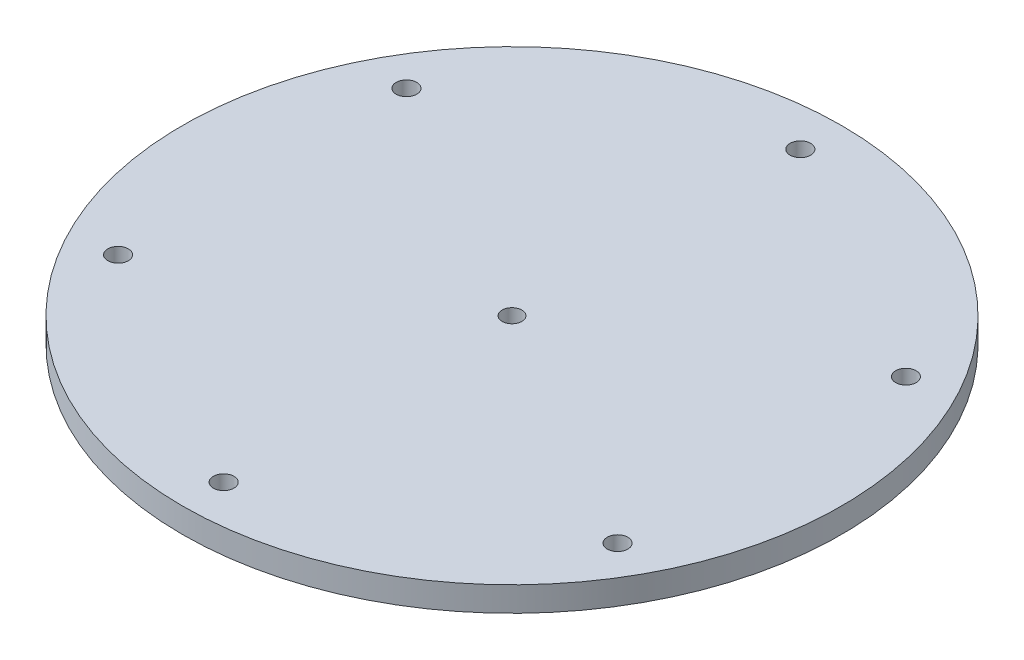
ISO-10303-21;
HEADER;
FILE_DESCRIPTION(('STEP AP214'),'2;1');
FILE_NAME('part.step','',(''),(''),'','','');
FILE_SCHEMA(('AUTOMOTIVE_DESIGN { 1 0 10303 214 1 1 1 1 }'));
ENDSEC;
DATA;
#1=APPLICATION_CONTEXT('core data for automotive mechanical design processes');
#2=APPLICATION_PROTOCOL_DEFINITION('international standard','automotive_design',2000,#1);
#3=PRODUCT_CONTEXT('',#1,'mechanical');
#4=PRODUCT('Part','Part','',(#3));
#5=PRODUCT_RELATED_PRODUCT_CATEGORY('part','',(#4));
#6=PRODUCT_DEFINITION_FORMATION('','',#4);
#7=PRODUCT_DEFINITION_CONTEXT('part definition',#1,'design');
#8=PRODUCT_DEFINITION('design','',#6,#7);
#9=PRODUCT_DEFINITION_SHAPE('','',#8);
#10=(LENGTH_UNIT() NAMED_UNIT(*) SI_UNIT(.MILLI.,.METRE.));
#11=(NAMED_UNIT(*) PLANE_ANGLE_UNIT() SI_UNIT($,.RADIAN.));
#12=(NAMED_UNIT(*) SI_UNIT($,.STERADIAN.) SOLID_ANGLE_UNIT());
#13=UNCERTAINTY_MEASURE_WITH_UNIT(LENGTH_MEASURE(1.E-05),#10,'distance_accuracy_value','');
#14=(GEOMETRIC_REPRESENTATION_CONTEXT(3) GLOBAL_UNCERTAINTY_ASSIGNED_CONTEXT((#13)) GLOBAL_UNIT_ASSIGNED_CONTEXT((#10,
#11,#12)) REPRESENTATION_CONTEXT('',''));
#15=CARTESIAN_POINT('',(0.,0.,0.));
#16=DIRECTION('',(0.,0.,1.));
#17=DIRECTION('',(1.,0.,0.));
#18=AXIS2_PLACEMENT_3D('',#15,#16,#17);
#19=CARTESIAN_POINT('',(0.,6.,0.));
#20=DIRECTION('',(0.,1.,0.));
#21=DIRECTION('',(0.,0.,1.));
#22=AXIS2_PLACEMENT_3D('',#19,#20,#21);
#23=PLANE('',#22);
#24=CARTESIAN_POINT('',(-60.6217782649063,6.,35.0000000000026));
#25=DIRECTION('',(0.,1.,0.));
#26=DIRECTION('',(0.,0.,1.));
#27=AXIS2_PLACEMENT_3D('',#24,#25,#26);
#28=CIRCLE('',#27,2.50000000000565);
#29=CARTESIAN_POINT('',(-60.6217782649063,6.,37.5000000000083));
#30=VERTEX_POINT('',#29);
#31=EDGE_CURVE('E71',#30,#30,#28,.T.);
#32=ORIENTED_EDGE('',*,*,#31,.F.);
#33=EDGE_LOOP('',(#32));
#34=FACE_BOUND('',#33,.T.);
#35=CARTESIAN_POINT('',(60.6217782649152,6.,34.9999999999974));
#36=DIRECTION('',(0.,1.,0.));
#37=DIRECTION('',(0.,0.,1.));
#38=AXIS2_PLACEMENT_3D('',#35,#36,#37);
#39=CIRCLE('',#38,2.50000000000384);
#40=CARTESIAN_POINT('',(60.6217782649152,6.,37.5000000000013));
#41=VERTEX_POINT('',#40);
#42=EDGE_CURVE('E59',#41,#41,#39,.T.);
#43=ORIENTED_EDGE('',*,*,#42,.F.);
#44=EDGE_LOOP('',(#43));
#45=FACE_BOUND('',#44,.T.);
#46=CARTESIAN_POINT('',(0.,6.,0.));
#47=DIRECTION('',(0.,1.,0.));
#48=DIRECTION('',(0.,0.,1.));
#49=AXIS2_PLACEMENT_3D('',#46,#47,#48);
#50=CIRCLE('',#49,2.4);
#51=CARTESIAN_POINT('',(0.,6.,2.4));
#52=VERTEX_POINT('',#51);
#53=EDGE_CURVE('E47',#52,#52,#50,.T.);
#54=ORIENTED_EDGE('',*,*,#53,.F.);
#55=EDGE_LOOP('',(#54));
#56=FACE_BOUND('',#55,.T.);
#57=CARTESIAN_POINT('',(0.,6.,0.));
#58=DIRECTION('',(0.,1.,0.));
#59=DIRECTION('',(0.,0.,1.));
#60=AXIS2_PLACEMENT_3D('',#57,#58,#59);
#61=CIRCLE('',#60,80.);
#62=CARTESIAN_POINT('',(0.,6.,80.));
#63=VERTEX_POINT('',#62);
#64=EDGE_CURVE('E10',#63,#63,#61,.T.);
#65=ORIENTED_EDGE('',*,*,#64,.T.);
#66=EDGE_LOOP('',(#65));
#67=FACE_BOUND('',#66,.T.);
#68=CARTESIAN_POINT('',(0.,6.,-70.));
#69=DIRECTION('',(0.,1.,0.));
#70=DIRECTION('',(0.,0.,1.));
#71=AXIS2_PLACEMENT_3D('',#68,#69,#70);
#72=CIRCLE('',#71,2.5);
#73=CARTESIAN_POINT('',(0.,6.,-67.5));
#74=VERTEX_POINT('',#73);
#75=EDGE_CURVE('E42',#74,#74,#72,.T.);
#76=ORIENTED_EDGE('',*,*,#75,.F.);
#77=EDGE_LOOP('',(#76));
#78=FACE_BOUND('',#77,.T.);
#79=CARTESIAN_POINT('',(60.6217782649122,6.,-35.0000000000026));
#80=DIRECTION('',(0.,1.,0.));
#81=DIRECTION('',(0.,0.,1.));
#82=AXIS2_PLACEMENT_3D('',#79,#80,#81);
#83=CIRCLE('',#82,2.50000000000082);
#84=CARTESIAN_POINT('',(60.6217782649122,6.,-32.5000000000018));
#85=VERTEX_POINT('',#84);
#86=EDGE_CURVE('E53',#85,#85,#83,.T.);
#87=ORIENTED_EDGE('',*,*,#86,.F.);
#88=EDGE_LOOP('',(#87));
#89=FACE_BOUND('',#88,.T.);
#90=CARTESIAN_POINT('',(5.94284139760275E-12,6.,70.));
#91=DIRECTION('',(0.,1.,0.));
#92=DIRECTION('',(0.,0.,1.));
#93=AXIS2_PLACEMENT_3D('',#90,#91,#92);
#94=CIRCLE('',#93,2.50000000000615);
#95=CARTESIAN_POINT('',(5.94284139760275E-12,6.,72.5000000000062));
#96=VERTEX_POINT('',#95);
#97=EDGE_CURVE('E65',#96,#96,#94,.T.);
#98=ORIENTED_EDGE('',*,*,#97,.F.);
#99=EDGE_LOOP('',(#98));
#100=FACE_BOUND('',#99,.T.);
#101=CARTESIAN_POINT('',(-60.6217782649093,6.,-34.9999999999974));
#102=DIRECTION('',(0.,1.,0.));
#103=DIRECTION('',(0.,0.,1.));
#104=AXIS2_PLACEMENT_3D('',#101,#102,#103);
#105=CIRCLE('',#104,2.500000000003);
#106=CARTESIAN_POINT('',(-60.6217782649093,6.,-32.4999999999944));
#107=VERTEX_POINT('',#106);
#108=EDGE_CURVE('E77',#107,#107,#105,.T.);
#109=ORIENTED_EDGE('',*,*,#108,.F.);
#110=EDGE_LOOP('',(#109));
#111=FACE_BOUND('',#110,.T.);
#112=ADVANCED_FACE('F31',(#34,#45,#56,#67,#78,#89,#100,#111),#23,.T.);
#113=CARTESIAN_POINT('',(0.,0.,0.));
#114=DIRECTION('',(0.,1.,0.));
#115=DIRECTION('',(0.,0.,1.));
#116=AXIS2_PLACEMENT_3D('',#113,#114,#115);
#117=PLANE('',#116);
#118=CARTESIAN_POINT('',(0.,0.,0.));
#119=DIRECTION('',(0.,1.,0.));
#120=DIRECTION('',(0.,0.,1.));
#121=AXIS2_PLACEMENT_3D('',#118,#119,#120);
#122=CIRCLE('',#121,80.);
#123=CARTESIAN_POINT('',(0.,0.,80.));
#124=VERTEX_POINT('',#123);
#125=EDGE_CURVE('E35',#124,#124,#122,.T.);
#126=ORIENTED_EDGE('',*,*,#125,.F.);
#127=EDGE_LOOP('',(#126));
#128=FACE_BOUND('',#127,.T.);
#129=CARTESIAN_POINT('',(0.,0.,-70.));
#130=DIRECTION('',(0.,1.,0.));
#131=DIRECTION('',(0.,0.,1.));
#132=AXIS2_PLACEMENT_3D('',#129,#130,#131);
#133=CIRCLE('',#132,2.5);
#134=CARTESIAN_POINT('',(0.,0.,-67.5));
#135=VERTEX_POINT('',#134);
#136=EDGE_CURVE('E44',#135,#135,#133,.T.);
#137=ORIENTED_EDGE('',*,*,#136,.T.);
#138=EDGE_LOOP('',(#137));
#139=FACE_BOUND('',#138,.T.);
#140=CARTESIAN_POINT('',(0.,0.,0.));
#141=DIRECTION('',(0.,1.,0.));
#142=DIRECTION('',(0.,0.,1.));
#143=AXIS2_PLACEMENT_3D('',#140,#141,#142);
#144=CIRCLE('',#143,2.4);
#145=CARTESIAN_POINT('',(0.,0.,2.4));
#146=VERTEX_POINT('',#145);
#147=EDGE_CURVE('E50',#146,#146,#144,.T.);
#148=ORIENTED_EDGE('',*,*,#147,.T.);
#149=EDGE_LOOP('',(#148));
#150=FACE_BOUND('',#149,.T.);
#151=CARTESIAN_POINT('',(60.6217782649122,0.,-35.0000000000026));
#152=DIRECTION('',(0.,1.,0.));
#153=DIRECTION('',(0.,0.,1.));
#154=AXIS2_PLACEMENT_3D('',#151,#152,#153);
#155=CIRCLE('',#154,2.50000000000082);
#156=CARTESIAN_POINT('',(60.6217782649122,0.,-32.5000000000018));
#157=VERTEX_POINT('',#156);
#158=EDGE_CURVE('E56',#157,#157,#155,.T.);
#159=ORIENTED_EDGE('',*,*,#158,.T.);
#160=EDGE_LOOP('',(#159));
#161=FACE_BOUND('',#160,.T.);
#162=CARTESIAN_POINT('',(60.6217782649152,0.,34.9999999999974));
#163=DIRECTION('',(0.,1.,0.));
#164=DIRECTION('',(0.,0.,1.));
#165=AXIS2_PLACEMENT_3D('',#162,#163,#164);
#166=CIRCLE('',#165,2.50000000000384);
#167=CARTESIAN_POINT('',(60.6217782649152,0.,37.5000000000013));
#168=VERTEX_POINT('',#167);
#169=EDGE_CURVE('E62',#168,#168,#166,.T.);
#170=ORIENTED_EDGE('',*,*,#169,.T.);
#171=EDGE_LOOP('',(#170));
#172=FACE_BOUND('',#171,.T.);
#173=CARTESIAN_POINT('',(5.94284139760275E-12,0.,70.));
#174=DIRECTION('',(0.,1.,0.));
#175=DIRECTION('',(0.,0.,1.));
#176=AXIS2_PLACEMENT_3D('',#173,#174,#175);
#177=CIRCLE('',#176,2.50000000000615);
#178=CARTESIAN_POINT('',(5.94284139760275E-12,0.,72.5000000000062));
#179=VERTEX_POINT('',#178);
#180=EDGE_CURVE('E68',#179,#179,#177,.T.);
#181=ORIENTED_EDGE('',*,*,#180,.T.);
#182=EDGE_LOOP('',(#181));
#183=FACE_BOUND('',#182,.T.);
#184=CARTESIAN_POINT('',(-60.6217782649063,0.,35.0000000000026));
#185=DIRECTION('',(0.,1.,0.));
#186=DIRECTION('',(0.,0.,1.));
#187=AXIS2_PLACEMENT_3D('',#184,#185,#186);
#188=CIRCLE('',#187,2.50000000000565);
#189=CARTESIAN_POINT('',(-60.6217782649063,0.,37.5000000000083));
#190=VERTEX_POINT('',#189);
#191=EDGE_CURVE('E74',#190,#190,#188,.T.);
#192=ORIENTED_EDGE('',*,*,#191,.T.);
#193=EDGE_LOOP('',(#192));
#194=FACE_BOUND('',#193,.T.);
#195=CARTESIAN_POINT('',(-60.6217782649093,0.,-34.9999999999974));
#196=DIRECTION('',(0.,1.,0.));
#197=DIRECTION('',(0.,0.,1.));
#198=AXIS2_PLACEMENT_3D('',#195,#196,#197);
#199=CIRCLE('',#198,2.500000000003);
#200=CARTESIAN_POINT('',(-60.6217782649093,0.,-32.4999999999944));
#201=VERTEX_POINT('',#200);
#202=EDGE_CURVE('E80',#201,#201,#199,.T.);
#203=ORIENTED_EDGE('',*,*,#202,.T.);
#204=EDGE_LOOP('',(#203));
#205=FACE_BOUND('',#204,.T.);
#206=ADVANCED_FACE('F90',(#128,#139,#150,#161,#172,#183,#194,#205),#117,.F.);
#207=CARTESIAN_POINT('',(0.,6.,0.));
#208=DIRECTION('',(0.,-1.,0.));
#209=DIRECTION('',(0.,0.,-1.));
#210=AXIS2_PLACEMENT_3D('',#207,#208,#209);
#211=CYLINDRICAL_SURFACE('',#210,80.);
#212=ORIENTED_EDGE('',*,*,#64,.F.);
#213=EDGE_LOOP('',(#212));
#214=FACE_BOUND('',#213,.T.);
#215=ORIENTED_EDGE('',*,*,#125,.T.);
#216=EDGE_LOOP('',(#215));
#217=FACE_BOUND('',#216,.T.);
#218=ADVANCED_FACE('F33',(#214,#217),#211,.T.);
#219=CARTESIAN_POINT('',(0.,6.,-70.));
#220=DIRECTION('',(0.,-1.,0.));
#221=DIRECTION('',(0.,0.,-1.));
#222=AXIS2_PLACEMENT_3D('',#219,#220,#221);
#223=CYLINDRICAL_SURFACE('',#222,2.5);
#224=ORIENTED_EDGE('',*,*,#75,.T.);
#225=EDGE_LOOP('',(#224));
#226=FACE_BOUND('',#225,.T.);
#227=ORIENTED_EDGE('',*,*,#136,.F.);
#228=EDGE_LOOP('',(#227));
#229=FACE_BOUND('',#228,.T.);
#230=ADVANCED_FACE('F100',(#226,#229),#223,.F.);
#231=CARTESIAN_POINT('',(0.,6.,0.));
#232=DIRECTION('',(0.,-1.,0.));
#233=DIRECTION('',(0.,0.,-1.));
#234=AXIS2_PLACEMENT_3D('',#231,#232,#233);
#235=CYLINDRICAL_SURFACE('',#234,2.4);
#236=ORIENTED_EDGE('',*,*,#53,.T.);
#237=EDGE_LOOP('',(#236));
#238=FACE_BOUND('',#237,.T.);
#239=ORIENTED_EDGE('',*,*,#147,.F.);
#240=EDGE_LOOP('',(#239));
#241=FACE_BOUND('',#240,.T.);
#242=ADVANCED_FACE('F103',(#238,#241),#235,.F.);
#243=CARTESIAN_POINT('',(60.6217782649122,6.,-35.0000000000026));
#244=DIRECTION('',(0.,-1.,0.));
#245=DIRECTION('',(0.,0.,-1.));
#246=AXIS2_PLACEMENT_3D('',#243,#244,#245);
#247=CYLINDRICAL_SURFACE('',#246,2.50000000000082);
#248=ORIENTED_EDGE('',*,*,#86,.T.);
#249=EDGE_LOOP('',(#248));
#250=FACE_BOUND('',#249,.T.);
#251=ORIENTED_EDGE('',*,*,#158,.F.);
#252=EDGE_LOOP('',(#251));
#253=FACE_BOUND('',#252,.T.);
#254=ADVANCED_FACE('F107',(#250,#253),#247,.F.);
#255=CARTESIAN_POINT('',(60.6217782649152,6.,34.9999999999974));
#256=DIRECTION('',(0.,-1.,0.));
#257=DIRECTION('',(0.,0.,-1.));
#258=AXIS2_PLACEMENT_3D('',#255,#256,#257);
#259=CYLINDRICAL_SURFACE('',#258,2.50000000000384);
#260=ORIENTED_EDGE('',*,*,#42,.T.);
#261=EDGE_LOOP('',(#260));
#262=FACE_BOUND('',#261,.T.);
#263=ORIENTED_EDGE('',*,*,#169,.F.);
#264=EDGE_LOOP('',(#263));
#265=FACE_BOUND('',#264,.T.);
#266=ADVANCED_FACE('F111',(#262,#265),#259,.F.);
#267=CARTESIAN_POINT('',(5.94284139760275E-12,6.,70.));
#268=DIRECTION('',(0.,-1.,0.));
#269=DIRECTION('',(0.,0.,-1.));
#270=AXIS2_PLACEMENT_3D('',#267,#268,#269);
#271=CYLINDRICAL_SURFACE('',#270,2.50000000000615);
#272=ORIENTED_EDGE('',*,*,#97,.T.);
#273=EDGE_LOOP('',(#272));
#274=FACE_BOUND('',#273,.T.);
#275=ORIENTED_EDGE('',*,*,#180,.F.);
#276=EDGE_LOOP('',(#275));
#277=FACE_BOUND('',#276,.T.);
#278=ADVANCED_FACE('F115',(#274,#277),#271,.F.);
#279=CARTESIAN_POINT('',(-60.6217782649063,6.,35.0000000000026));
#280=DIRECTION('',(0.,-1.,0.));
#281=DIRECTION('',(0.,0.,-1.));
#282=AXIS2_PLACEMENT_3D('',#279,#280,#281);
#283=CYLINDRICAL_SURFACE('',#282,2.50000000000565);
#284=ORIENTED_EDGE('',*,*,#31,.T.);
#285=EDGE_LOOP('',(#284));
#286=FACE_BOUND('',#285,.T.);
#287=ORIENTED_EDGE('',*,*,#191,.F.);
#288=EDGE_LOOP('',(#287));
#289=FACE_BOUND('',#288,.T.);
#290=ADVANCED_FACE('F119',(#286,#289),#283,.F.);
#291=CARTESIAN_POINT('',(-60.6217782649093,6.,-34.9999999999974));
#292=DIRECTION('',(0.,-1.,0.));
#293=DIRECTION('',(0.,0.,-1.));
#294=AXIS2_PLACEMENT_3D('',#291,#292,#293);
#295=CYLINDRICAL_SURFACE('',#294,2.500000000003);
#296=ORIENTED_EDGE('',*,*,#108,.T.);
#297=EDGE_LOOP('',(#296));
#298=FACE_BOUND('',#297,.T.);
#299=ORIENTED_EDGE('',*,*,#202,.F.);
#300=EDGE_LOOP('',(#299));
#301=FACE_BOUND('',#300,.T.);
#302=ADVANCED_FACE('F86',(#298,#301),#295,.F.);
#303=CLOSED_SHELL('',(#112,#206,#218,#230,#242,#254,#266,#278,#290,#302));
#304=MANIFOLD_SOLID_BREP('B2',#303);
#305=ADVANCED_BREP_SHAPE_REPRESENTATION('',(#18,#304),#14);
#306=SHAPE_DEFINITION_REPRESENTATION(#9,#305);
ENDSEC;
END-ISO-10303-21;
